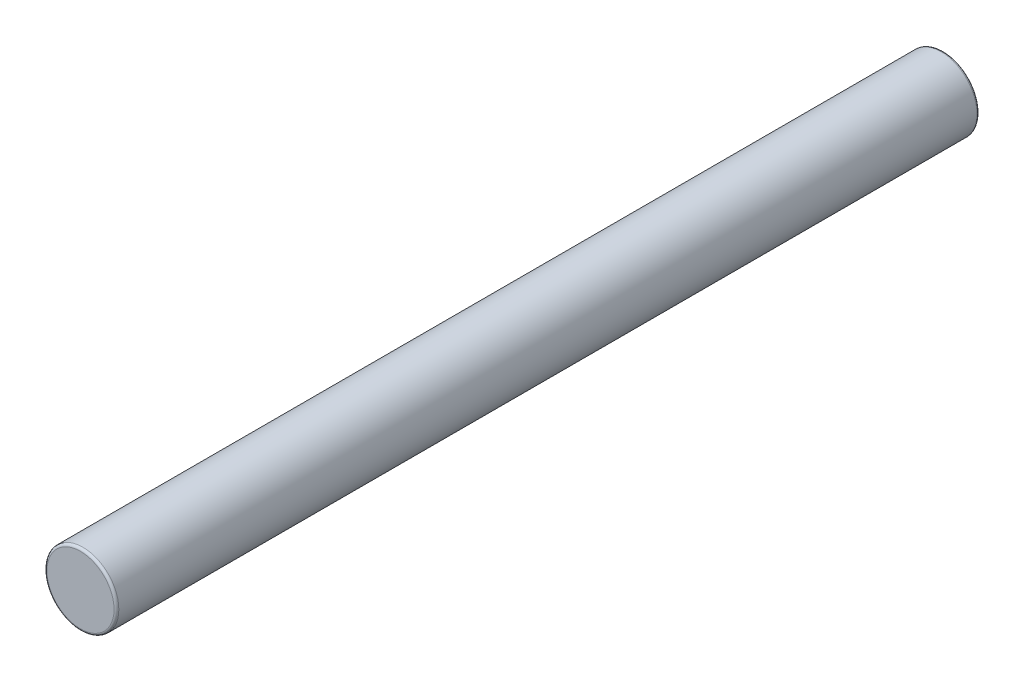
ISO-10303-21;
HEADER;
FILE_DESCRIPTION(('STEP AP214'),'2;1');
FILE_NAME('part.step','',(''),(''),'','','');
FILE_SCHEMA(('AUTOMOTIVE_DESIGN { 1 0 10303 214 1 1 1 1 }'));
ENDSEC;
DATA;
#1=APPLICATION_CONTEXT('core data for automotive mechanical design processes');
#2=APPLICATION_PROTOCOL_DEFINITION('international standard','automotive_design',2000,#1);
#3=PRODUCT_CONTEXT('',#1,'mechanical');
#4=PRODUCT('Part','Part','',(#3));
#5=PRODUCT_RELATED_PRODUCT_CATEGORY('part','',(#4));
#6=PRODUCT_DEFINITION_FORMATION('','',#4);
#7=PRODUCT_DEFINITION_CONTEXT('part definition',#1,'design');
#8=PRODUCT_DEFINITION('design','',#6,#7);
#9=PRODUCT_DEFINITION_SHAPE('','',#8);
#10=(LENGTH_UNIT() NAMED_UNIT(*) SI_UNIT(.MILLI.,.METRE.));
#11=(NAMED_UNIT(*) PLANE_ANGLE_UNIT() SI_UNIT($,.RADIAN.));
#12=(NAMED_UNIT(*) SI_UNIT($,.STERADIAN.) SOLID_ANGLE_UNIT());
#13=UNCERTAINTY_MEASURE_WITH_UNIT(LENGTH_MEASURE(1.E-05),#10,'distance_accuracy_value','');
#14=(GEOMETRIC_REPRESENTATION_CONTEXT(3) GLOBAL_UNCERTAINTY_ASSIGNED_CONTEXT((#13)) GLOBAL_UNIT_ASSIGNED_CONTEXT((#10,
#11,#12)) REPRESENTATION_CONTEXT('',''));
#15=CARTESIAN_POINT('',(0.,0.,0.));
#16=DIRECTION('',(0.,0.,1.));
#17=DIRECTION('',(1.,0.,0.));
#18=AXIS2_PLACEMENT_3D('',#15,#16,#17);
#19=CARTESIAN_POINT('',(0.,0.,36.));
#20=DIRECTION('',(0.,0.,-1.));
#21=DIRECTION('',(-1.,0.,0.));
#22=AXIS2_PLACEMENT_3D('',#19,#20,#21);
#23=CYLINDRICAL_SURFACE('',#22,1.5);
#24=CARTESIAN_POINT('',(0.,0.,0.100000000000003));
#25=DIRECTION('',(0.,0.,1.));
#26=DIRECTION('',(1.,0.,0.));
#27=AXIS2_PLACEMENT_3D('',#24,#25,#26);
#28=CIRCLE('',#27,1.5);
#29=CARTESIAN_POINT('',(1.5,0.,0.100000000000003));
#30=VERTEX_POINT('',#29);
#31=EDGE_CURVE('E35',#30,#30,#28,.T.);
#32=ORIENTED_EDGE('',*,*,#31,.T.);
#33=EDGE_LOOP('',(#32));
#34=FACE_BOUND('',#33,.T.);
#35=CARTESIAN_POINT('',(0.,0.,35.9));
#36=DIRECTION('',(0.,0.,1.));
#37=DIRECTION('',(1.,0.,0.));
#38=AXIS2_PLACEMENT_3D('',#35,#36,#37);
#39=CIRCLE('',#38,1.5);
#40=CARTESIAN_POINT('',(1.5,0.,35.9));
#41=VERTEX_POINT('',#40);
#42=EDGE_CURVE('E39',#41,#41,#39,.F.);
#43=ORIENTED_EDGE('',*,*,#42,.T.);
#44=EDGE_LOOP('',(#43));
#45=FACE_BOUND('',#44,.T.);
#46=ADVANCED_FACE('F25',(#34,#45),#23,.T.);
#47=CARTESIAN_POINT('',(0.,0.,36.));
#48=DIRECTION('',(0.,0.,1.));
#49=DIRECTION('',(1.,0.,0.));
#50=AXIS2_PLACEMENT_3D('',#47,#48,#49);
#51=PLANE('',#50);
#52=CARTESIAN_POINT('',(0.,0.,36.));
#53=DIRECTION('',(0.,0.,1.));
#54=DIRECTION('',(1.,0.,0.));
#55=AXIS2_PLACEMENT_3D('',#52,#53,#54);
#56=CIRCLE('',#55,1.4);
#57=CARTESIAN_POINT('',(1.4,0.,36.));
#58=VERTEX_POINT('',#57);
#59=EDGE_CURVE('E10',#58,#58,#56,.T.);
#60=ORIENTED_EDGE('',*,*,#59,.T.);
#61=EDGE_LOOP('',(#60));
#62=FACE_BOUND('',#61,.T.);
#63=ADVANCED_FACE('F58',(#62),#51,.T.);
#64=CARTESIAN_POINT('',(0.,0.,0.));
#65=DIRECTION('',(0.,0.,1.));
#66=DIRECTION('',(1.,0.,0.));
#67=AXIS2_PLACEMENT_3D('',#64,#65,#66);
#68=PLANE('',#67);
#69=CARTESIAN_POINT('',(0.,0.,0.));
#70=DIRECTION('',(0.,0.,1.));
#71=DIRECTION('',(1.,0.,0.));
#72=AXIS2_PLACEMENT_3D('',#69,#70,#71);
#73=CIRCLE('',#72,1.4);
#74=CARTESIAN_POINT('',(1.4,0.,0.));
#75=VERTEX_POINT('',#74);
#76=EDGE_CURVE('E31',#75,#75,#73,.F.);
#77=ORIENTED_EDGE('',*,*,#76,.T.);
#78=EDGE_LOOP('',(#77));
#79=FACE_BOUND('',#78,.T.);
#80=ADVANCED_FACE('F54',(#79),#68,.F.);
#81=CARTESIAN_POINT('',(0.,0.,0.100000000000003));
#82=DIRECTION('',(0.,0.,1.));
#83=DIRECTION('',(1.,0.,0.));
#84=AXIS2_PLACEMENT_3D('',#81,#82,#83);
#85=TOROIDAL_SURFACE('',#84,1.4,0.1);
#86=ORIENTED_EDGE('',*,*,#76,.F.);
#87=EDGE_LOOP('',(#86));
#88=FACE_BOUND('',#87,.T.);
#89=ORIENTED_EDGE('',*,*,#31,.F.);
#90=EDGE_LOOP('',(#89));
#91=FACE_BOUND('',#90,.T.);
#92=ADVANCED_FACE('F49',(#88,#91),#85,.T.);
#93=CARTESIAN_POINT('',(0.,0.,35.9));
#94=DIRECTION('',(0.,0.,1.));
#95=DIRECTION('',(1.,0.,0.));
#96=AXIS2_PLACEMENT_3D('',#93,#94,#95);
#97=TOROIDAL_SURFACE('',#96,1.4,0.1);
#98=ORIENTED_EDGE('',*,*,#42,.F.);
#99=EDGE_LOOP('',(#98));
#100=FACE_BOUND('',#99,.T.);
#101=ORIENTED_EDGE('',*,*,#59,.F.);
#102=EDGE_LOOP('',(#101));
#103=FACE_BOUND('',#102,.T.);
#104=ADVANCED_FACE('F46',(#100,#103),#97,.T.);
#105=CLOSED_SHELL('',(#46,#63,#80,#92,#104));
#106=MANIFOLD_SOLID_BREP('B2',#105);
#107=ADVANCED_BREP_SHAPE_REPRESENTATION('',(#18,#106),#14);
#108=SHAPE_DEFINITION_REPRESENTATION(#9,#107);
ENDSEC;
END-ISO-10303-21;
